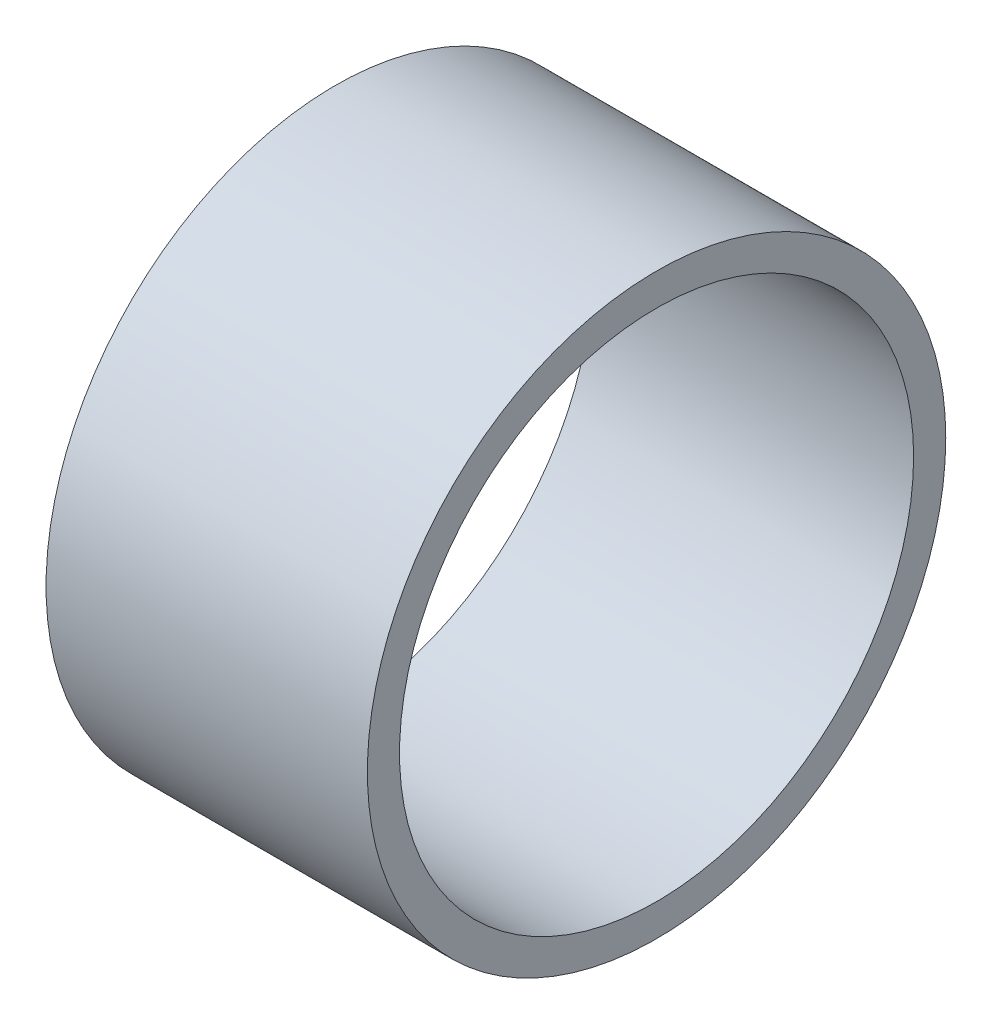
ISO-10303-21;
HEADER;
FILE_DESCRIPTION(('STEP AP214'),'2;1');
FILE_NAME('part.step','',(''),(''),'','','');
FILE_SCHEMA(('AUTOMOTIVE_DESIGN { 1 0 10303 214 1 1 1 1 }'));
ENDSEC;
DATA;
#1=APPLICATION_CONTEXT('core data for automotive mechanical design processes');
#2=APPLICATION_PROTOCOL_DEFINITION('international standard','automotive_design',2000,#1);
#3=PRODUCT_CONTEXT('',#1,'mechanical');
#4=PRODUCT('Part','Part','',(#3));
#5=PRODUCT_RELATED_PRODUCT_CATEGORY('part','',(#4));
#6=PRODUCT_DEFINITION_FORMATION('','',#4);
#7=PRODUCT_DEFINITION_CONTEXT('part definition',#1,'design');
#8=PRODUCT_DEFINITION('design','',#6,#7);
#9=PRODUCT_DEFINITION_SHAPE('','',#8);
#10=(LENGTH_UNIT() NAMED_UNIT(*) SI_UNIT(.MILLI.,.METRE.));
#11=(NAMED_UNIT(*) PLANE_ANGLE_UNIT() SI_UNIT($,.RADIAN.));
#12=(NAMED_UNIT(*) SI_UNIT($,.STERADIAN.) SOLID_ANGLE_UNIT());
#13=UNCERTAINTY_MEASURE_WITH_UNIT(LENGTH_MEASURE(1.E-05),#10,'distance_accuracy_value','');
#14=(GEOMETRIC_REPRESENTATION_CONTEXT(3) GLOBAL_UNCERTAINTY_ASSIGNED_CONTEXT((#13)) GLOBAL_UNIT_ASSIGNED_CONTEXT((#10,
#11,#12)) REPRESENTATION_CONTEXT('',''));
#15=CARTESIAN_POINT('',(0.,0.,0.));
#16=DIRECTION('',(0.,0.,1.));
#17=DIRECTION('',(1.,0.,0.));
#18=AXIS2_PLACEMENT_3D('',#15,#16,#17);
#19=CARTESIAN_POINT('',(10.,0.,0.));
#20=DIRECTION('',(1.,0.,0.));
#21=DIRECTION('',(0.,0.,-1.));
#22=AXIS2_PLACEMENT_3D('',#19,#20,#21);
#23=PLANE('',#22);
#24=CARTESIAN_POINT('',(10.,0.,0.));
#25=DIRECTION('',(1.,0.,0.));
#26=DIRECTION('',(0.,0.,-1.));
#27=AXIS2_PLACEMENT_3D('',#24,#25,#26);
#28=CIRCLE('',#27,9.);
#29=CARTESIAN_POINT('',(10.,0.,-9.));
#30=VERTEX_POINT('',#29);
#31=EDGE_CURVE('E10',#30,#30,#28,.T.);
#32=ORIENTED_EDGE('',*,*,#31,.T.);
#33=EDGE_LOOP('',(#32));
#34=FACE_BOUND('',#33,.T.);
#35=CARTESIAN_POINT('',(10.,0.,0.));
#36=DIRECTION('',(1.,0.,0.));
#37=DIRECTION('',(0.,0.,-1.));
#38=AXIS2_PLACEMENT_3D('',#35,#36,#37);
#39=CIRCLE('',#38,8.);
#40=CARTESIAN_POINT('',(10.,0.,-8.));
#41=VERTEX_POINT('',#40);
#42=EDGE_CURVE('E42',#41,#41,#39,.T.);
#43=ORIENTED_EDGE('',*,*,#42,.F.);
#44=EDGE_LOOP('',(#43));
#45=FACE_BOUND('',#44,.T.);
#46=ADVANCED_FACE('F31',(#34,#45),#23,.T.);
#47=CARTESIAN_POINT('',(0.,0.,0.));
#48=DIRECTION('',(1.,0.,0.));
#49=DIRECTION('',(0.,0.,-1.));
#50=AXIS2_PLACEMENT_3D('',#47,#48,#49);
#51=PLANE('',#50);
#52=CARTESIAN_POINT('',(0.,0.,0.));
#53=DIRECTION('',(1.,0.,0.));
#54=DIRECTION('',(0.,0.,-1.));
#55=AXIS2_PLACEMENT_3D('',#52,#53,#54);
#56=CIRCLE('',#55,9.);
#57=CARTESIAN_POINT('',(0.,0.,-9.));
#58=VERTEX_POINT('',#57);
#59=EDGE_CURVE('E35',#58,#58,#56,.T.);
#60=ORIENTED_EDGE('',*,*,#59,.F.);
#61=EDGE_LOOP('',(#60));
#62=FACE_BOUND('',#61,.T.);
#63=CARTESIAN_POINT('',(0.,0.,0.));
#64=DIRECTION('',(1.,0.,0.));
#65=DIRECTION('',(0.,0.,-1.));
#66=AXIS2_PLACEMENT_3D('',#63,#64,#65);
#67=CIRCLE('',#66,8.);
#68=CARTESIAN_POINT('',(0.,0.,-8.));
#69=VERTEX_POINT('',#68);
#70=EDGE_CURVE('E44',#69,#69,#67,.T.);
#71=ORIENTED_EDGE('',*,*,#70,.T.);
#72=EDGE_LOOP('',(#71));
#73=FACE_BOUND('',#72,.T.);
#74=ADVANCED_FACE('F54',(#62,#73),#51,.F.);
#75=CARTESIAN_POINT('',(10.,0.,0.));
#76=DIRECTION('',(-1.,0.,0.));
#77=DIRECTION('',(0.,0.,1.));
#78=AXIS2_PLACEMENT_3D('',#75,#76,#77);
#79=CYLINDRICAL_SURFACE('',#78,9.);
#80=ORIENTED_EDGE('',*,*,#31,.F.);
#81=EDGE_LOOP('',(#80));
#82=FACE_BOUND('',#81,.T.);
#83=ORIENTED_EDGE('',*,*,#59,.T.);
#84=EDGE_LOOP('',(#83));
#85=FACE_BOUND('',#84,.T.);
#86=ADVANCED_FACE('F33',(#82,#85),#79,.T.);
#87=CARTESIAN_POINT('',(10.,0.,0.));
#88=DIRECTION('',(-1.,0.,0.));
#89=DIRECTION('',(0.,0.,1.));
#90=AXIS2_PLACEMENT_3D('',#87,#88,#89);
#91=CYLINDRICAL_SURFACE('',#90,8.);
#92=ORIENTED_EDGE('',*,*,#42,.T.);
#93=EDGE_LOOP('',(#92));
#94=FACE_BOUND('',#93,.T.);
#95=ORIENTED_EDGE('',*,*,#70,.F.);
#96=EDGE_LOOP('',(#95));
#97=FACE_BOUND('',#96,.T.);
#98=ADVANCED_FACE('F50',(#94,#97),#91,.F.);
#99=CLOSED_SHELL('',(#46,#74,#86,#98));
#100=MANIFOLD_SOLID_BREP('B2',#99);
#101=ADVANCED_BREP_SHAPE_REPRESENTATION('',(#18,#100),#14);
#102=SHAPE_DEFINITION_REPRESENTATION(#9,#101);
ENDSEC;
END-ISO-10303-21;
